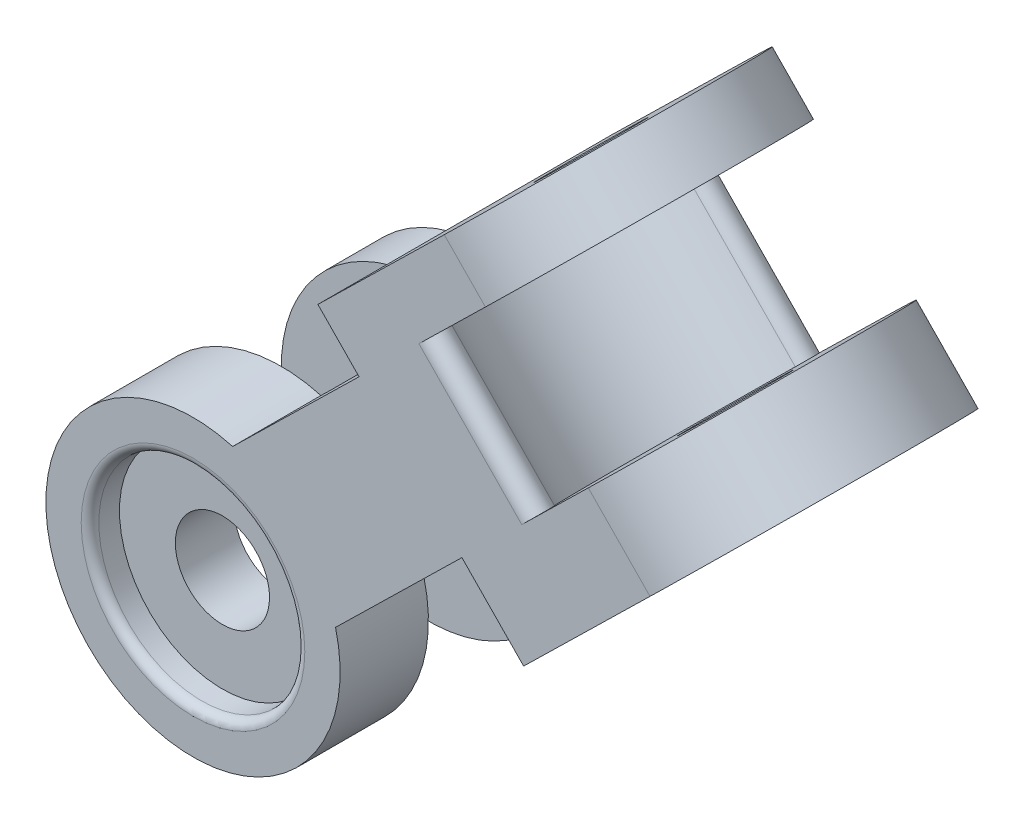
ISO-10303-21;
HEADER;
FILE_DESCRIPTION(('STEP AP214'),'2;1');
FILE_NAME('part.step','',(''),(''),'','','');
FILE_SCHEMA(('AUTOMOTIVE_DESIGN { 1 0 10303 214 1 1 1 1 }'));
ENDSEC;
DATA;
#1=APPLICATION_CONTEXT('core data for automotive mechanical design processes');
#2=APPLICATION_PROTOCOL_DEFINITION('international standard','automotive_design',2000,#1);
#3=PRODUCT_CONTEXT('',#1,'mechanical');
#4=PRODUCT('Part','Part','',(#3));
#5=PRODUCT_RELATED_PRODUCT_CATEGORY('part','',(#4));
#6=PRODUCT_DEFINITION_FORMATION('','',#4);
#7=PRODUCT_DEFINITION_CONTEXT('part definition',#1,'design');
#8=PRODUCT_DEFINITION('design','',#6,#7);
#9=PRODUCT_DEFINITION_SHAPE('','',#8);
#10=(LENGTH_UNIT() NAMED_UNIT(*) SI_UNIT(.MILLI.,.METRE.));
#11=(NAMED_UNIT(*) PLANE_ANGLE_UNIT() SI_UNIT($,.RADIAN.));
#12=(NAMED_UNIT(*) SI_UNIT($,.STERADIAN.) SOLID_ANGLE_UNIT());
#13=UNCERTAINTY_MEASURE_WITH_UNIT(LENGTH_MEASURE(1.E-05),#10,'distance_accuracy_value','');
#14=(GEOMETRIC_REPRESENTATION_CONTEXT(3) GLOBAL_UNCERTAINTY_ASSIGNED_CONTEXT((#13)) GLOBAL_UNIT_ASSIGNED_CONTEXT((#10,
#11,#12)) REPRESENTATION_CONTEXT('',''));
#15=CARTESIAN_POINT('',(0.,0.,0.));
#16=DIRECTION('',(0.,0.,1.));
#17=DIRECTION('',(1.,0.,0.));
#18=AXIS2_PLACEMENT_3D('',#15,#16,#17);
#19=CARTESIAN_POINT('',(-0.251682910888285,0.0196399048580098,2.));
#20=DIRECTION('',(0.,0.,-1.));
#21=DIRECTION('',(-1.,0.,0.));
#22=AXIS2_PLACEMENT_3D('',#19,#20,#21);
#23=CYLINDRICAL_SURFACE('',#22,1.6);
#24=CARTESIAN_POINT('',(-0.251682910888285,0.0196399048580098,-1.));
#25=DIRECTION('',(0.,0.,-1.));
#26=DIRECTION('',(-1.,0.,0.));
#27=AXIS2_PLACEMENT_3D('',#24,#25,#26);
#28=CIRCLE('',#27,1.6);
#29=CARTESIAN_POINT('',(-1.85168291088829,0.0196399048580098,-1.));
#30=VERTEX_POINT('',#29);
#31=EDGE_CURVE('E478',#30,#30,#28,.T.);
#32=ORIENTED_EDGE('',*,*,#31,.T.);
#33=EDGE_LOOP('',(#32));
#34=FACE_BOUND('',#33,.T.);
#35=CARTESIAN_POINT('',(-0.251682910888285,0.0196399048580098,1.));
#36=DIRECTION('',(0.,0.,1.));
#37=DIRECTION('',(1.,0.,0.));
#38=AXIS2_PLACEMENT_3D('',#35,#36,#37);
#39=CIRCLE('',#38,1.6);
#40=CARTESIAN_POINT('',(1.34831708911172,0.0196399048580098,1.));
#41=VERTEX_POINT('',#40);
#42=EDGE_CURVE('E883',#41,#41,#39,.T.);
#43=ORIENTED_EDGE('',*,*,#42,.T.);
#44=EDGE_LOOP('',(#43));
#45=FACE_BOUND('',#44,.T.);
#46=ADVANCED_FACE('F100',(#34,#45),#23,.F.);
#47=CARTESIAN_POINT('',(8.28738801972482,14.6639336938812,-3.));
#48=DIRECTION('',(0.699159308456011,-0.714965916250077,0.));
#49=DIRECTION('',(0.714965916250077,0.699159308456011,0.));
#50=AXIS2_PLACEMENT_3D('',#47,#48,#49);
#51=CYLINDRICAL_SURFACE('',#50,1.6);
#52=CARTESIAN_POINT('',(13.1815031789169,9.65917228013068,-3.));
#53=DIRECTION('',(-0.699159308456011,0.714965916250077,0.));
#54=DIRECTION('',(-0.714965916250077,-0.699159308456011,0.));
#55=AXIS2_PLACEMENT_3D('',#52,#53,#54);
#56=CIRCLE('',#55,1.6);
#57=CARTESIAN_POINT('',(12.0375577129168,8.54051738660106,-3.));
#58=VERTEX_POINT('',#57);
#59=EDGE_CURVE('E454',#58,#58,#56,.T.);
#60=ORIENTED_EDGE('',*,*,#59,.T.);
#61=EDGE_LOOP('',(#60));
#62=FACE_BOUND('',#61,.T.);
#63=CARTESIAN_POINT('',(14.5798217958289,8.22924044763053,-3.));
#64=DIRECTION('',(0.699159308456011,-0.714965916250077,0.));
#65=DIRECTION('',(0.714965916250077,0.699159308456011,0.));
#66=AXIS2_PLACEMENT_3D('',#63,#64,#65);
#67=CIRCLE('',#66,1.6);
#68=CARTESIAN_POINT('',(15.723767261829,9.34789534116014,-3.));
#69=VERTEX_POINT('',#68);
#70=EDGE_CURVE('E875',#69,#69,#67,.T.);
#71=ORIENTED_EDGE('',*,*,#70,.T.);
#72=EDGE_LOOP('',(#71));
#73=FACE_BOUND('',#72,.T.);
#74=ADVANCED_FACE('F343',(#62,#73),#51,.F.);
#75=CARTESIAN_POINT('',(8.28738801972482,14.6639336938812,-3.));
#76=DIRECTION('',(0.699159308456011,-0.714965916250077,0.));
#77=DIRECTION('',(0.714965916250077,0.699159308456011,0.));
#78=AXIS2_PLACEMENT_3D('',#75,#76,#77);
#79=CYLINDRICAL_SURFACE('',#78,5.);
#80=CARTESIAN_POINT('',(9.68570663663685,13.2340018613811,-3.));
#81=DIRECTION('',(0.699159308456011,-0.714965916250077,0.));
#82=DIRECTION('',(0.714965916250077,0.699159308456011,0.));
#83=AXIS2_PLACEMENT_3D('',#80,#81,#82);
#84=CIRCLE('',#83,5.);
#85=CARTESIAN_POINT('',(9.68570663663684,13.2340018613811,-8.));
#86=VERTEX_POINT('',#85);
#87=CARTESIAN_POINT('',(9.68570663663684,13.2340018613811,2.));
#88=VERTEX_POINT('',#87);
#89=EDGE_CURVE('E253',#86,#88,#84,.T.);
#90=ORIENTED_EDGE('',*,*,#89,.F.);
#91=DIRECTION('',(-0.699159308456012,0.714965916250077,0.));
#92=VECTOR('',#91,1.);
#93=CARTESIAN_POINT('',(11.5664509881444,11.3107376035151,-8.));
#94=LINE('',#93,#92);
#95=CARTESIAN_POINT('',(8.28738801972482,14.6639336938812,-8.));
#96=VERTEX_POINT('',#95);
#97=EDGE_CURVE('E419',#86,#96,#94,.T.);
#98=ORIENTED_EDGE('',*,*,#97,.T.);
#99=CARTESIAN_POINT('',(8.28738801972482,14.6639336938812,-3.));
#100=DIRECTION('',(-0.699159308456011,0.714965916250077,0.));
#101=DIRECTION('',(-0.714965916250077,-0.699159308456011,0.));
#102=AXIS2_PLACEMENT_3D('',#99,#100,#101);
#103=CIRCLE('',#102,5.);
#104=CARTESIAN_POINT('',(8.28738801972483,14.6639336938812,2.));
#105=VERTEX_POINT('',#104);
#106=EDGE_CURVE('E265',#105,#96,#103,.T.);
#107=ORIENTED_EDGE('',*,*,#106,.F.);
#108=DIRECTION('',(-0.699159308456012,0.714965916250077,0.));
#109=VECTOR('',#108,1.);
#110=CARTESIAN_POINT('',(11.5664509881444,11.3107376035151,2.));
#111=LINE('',#110,#109);
#112=EDGE_CURVE('E244',#88,#105,#111,.T.);
#113=ORIENTED_EDGE('',*,*,#112,.F.);
#114=EDGE_LOOP('',(#90,#98,#107,#113));
#115=FACE_BOUND('',#114,.T.);
#116=ADVANCED_FACE('F263',(#115),#79,.T.);
#117=CARTESIAN_POINT('',(8.28738801972482,14.6639336938812,-3.));
#118=DIRECTION('',(-0.699159308456011,0.714965916250077,0.));
#119=DIRECTION('',(-0.714965916250077,-0.699159308456011,0.));
#120=AXIS2_PLACEMENT_3D('',#117,#118,#119);
#121=CIRCLE('',#120,1.6);
#122=CARTESIAN_POINT('',(7.1434425537247,13.5452788003516,-3.));
#123=VERTEX_POINT('',#122);
#124=EDGE_CURVE('E461',#123,#123,#121,.T.);
#125=ORIENTED_EDGE('',*,*,#124,.T.);
#126=EDGE_LOOP('',(#125));
#127=FACE_BOUND('',#126,.T.);
#128=CARTESIAN_POINT('',(9.68570663663684,13.2340018613811,-3.));
#129=DIRECTION('',(-0.699159308456011,0.714965916250077,0.));
#130=DIRECTION('',(-0.714965916250077,-0.699159308456011,0.));
#131=AXIS2_PLACEMENT_3D('',#128,#129,#130);
#132=CIRCLE('',#131,1.6);
#133=CARTESIAN_POINT('',(8.54176117063672,12.1153469678514,-3.));
#134=VERTEX_POINT('',#133);
#135=EDGE_CURVE('E460',#134,#134,#132,.T.);
#136=ORIENTED_EDGE('',*,*,#135,.F.);
#137=EDGE_LOOP('',(#136));
#138=FACE_BOUND('',#137,.T.);
#139=ADVANCED_FACE('F353',(#127,#138),#51,.F.);
#140=CARTESIAN_POINT('',(-0.251682910888285,0.0196399048580098,2.));
#141=DIRECTION('',(0.,0.,-1.));
#142=DIRECTION('',(-1.,0.,0.));
#143=AXIS2_PLACEMENT_3D('',#140,#141,#142);
#144=CYLINDRICAL_SURFACE('',#143,5.);
#145=DIRECTION('',(0.,0.,-1.));
#146=VECTOR('',#145,1.);
#147=CARTESIAN_POINT('',(1.0963120495346,4.83450330755953,2.));
#148=LINE('',#147,#146);
#149=CARTESIAN_POINT('',(1.0963120495346,4.83450330755953,2.));
#150=VERTEX_POINT('',#149);
#151=CARTESIAN_POINT('',(1.0963120495346,4.83450330755953,-1.));
#152=VERTEX_POINT('',#151);
#153=EDGE_CURVE('E279',#150,#152,#148,.T.);
#154=ORIENTED_EDGE('',*,*,#153,.T.);
#155=CARTESIAN_POINT('',(-0.251682910888285,0.0196399048580098,-1.));
#156=DIRECTION('',(0.,0.,-1.));
#157=DIRECTION('',(-1.,0.,0.));
#158=AXIS2_PLACEMENT_3D('',#155,#156,#157);
#159=CIRCLE('',#158,5.);
#160=CARTESIAN_POINT('',(4.59210859181466,1.25967372630915,-1.));
#161=VERTEX_POINT('',#160);
#162=EDGE_CURVE('E386',#161,#152,#159,.T.);
#163=ORIENTED_EDGE('',*,*,#162,.F.);
#164=DIRECTION('',(0.,0.,-1.));
#165=VECTOR('',#164,1.);
#166=CARTESIAN_POINT('',(4.59210859181466,1.25967372630915,2.));
#167=LINE('',#166,#165);
#168=CARTESIAN_POINT('',(4.59210859181466,1.25967372630915,2.));
#169=VERTEX_POINT('',#168);
#170=EDGE_CURVE('E276',#169,#161,#167,.T.);
#171=ORIENTED_EDGE('',*,*,#170,.F.);
#172=CARTESIAN_POINT('',(-0.251682910888285,0.0196399048580098,2.));
#173=DIRECTION('',(0.,0.,1.));
#174=DIRECTION('',(1.,0.,0.));
#175=AXIS2_PLACEMENT_3D('',#172,#173,#174);
#176=CIRCLE('',#175,5.);
#177=EDGE_CURVE('E272',#169,#150,#176,.F.);
#178=ORIENTED_EDGE('',*,*,#177,.T.);
#179=EDGE_LOOP('',(#154,#163,#171,#178));
#180=FACE_BOUND('',#179,.T.);
#181=ADVANCED_FACE('F396',(#180),#144,.T.);
#182=CARTESIAN_POINT('',(-1.88074435150754,1.92326425786598,2.));
#183=DIRECTION('',(0.699159308456011,-0.714965916250078,0.));
#184=DIRECTION('',(0.714965916250078,0.699159308456011,0.));
#185=AXIS2_PLACEMENT_3D('',#182,#183,#184);
#186=PLANE('',#185);
#187=DIRECTION('',(0.,0.,-1.));
#188=VECTOR('',#187,1.);
#189=CARTESIAN_POINT('',(1.44785961913622,5.17827879400677,2.));
#190=LINE('',#189,#188);
#191=CARTESIAN_POINT('',(1.44785961913622,5.17827879400677,-6.));
#192=VERTEX_POINT('',#191);
#193=CARTESIAN_POINT('',(1.44785961913622,5.17827879400677,-1.));
#194=VERTEX_POINT('',#193);
#195=EDGE_CURVE('E304',#192,#194,#190,.F.);
#196=ORIENTED_EDGE('',*,*,#195,.T.);
#197=DIRECTION('',(-0.714965916250078,-0.699159308456011,0.));
#198=VECTOR('',#197,1.);
#199=CARTESIAN_POINT('',(-1.99958118202832,1.80705469548321,-1.));
#200=LINE('',#199,#198);
#201=EDGE_CURVE('E307',#194,#152,#200,.T.);
#202=ORIENTED_EDGE('',*,*,#201,.T.);
#203=ORIENTED_EDGE('',*,*,#153,.F.);
#204=DIRECTION('',(-0.714965916250078,-0.699159308456011,0.));
#205=VECTOR('',#204,1.);
#206=CARTESIAN_POINT('',(-1.88074435150754,1.92326425786598,2.));
#207=LINE('',#206,#205);
#208=CARTESIAN_POINT('',(5.39100934308572,9.0342525844703,2.));
#209=VERTEX_POINT('',#208);
#210=EDGE_CURVE('E392',#209,#150,#207,.T.);
#211=ORIENTED_EDGE('',*,*,#210,.F.);
#212=DIRECTION('',(0.,0.,1.));
#213=VECTOR('',#212,1.);
#214=CARTESIAN_POINT('',(5.39100934308572,9.0342525844703,0.));
#215=LINE('',#214,#213);
#216=CARTESIAN_POINT('',(5.39100934308572,9.0342525844703,-8.));
#217=VERTEX_POINT('',#216);
#218=EDGE_CURVE('E464',#217,#209,#215,.T.);
#219=ORIENTED_EDGE('',*,*,#218,.F.);
#220=DIRECTION('',(-0.714965916250078,-0.699159308456011,0.));
#221=VECTOR('',#220,1.);
#222=CARTESIAN_POINT('',(-1.88074435150754,1.92326425786598,-8.));
#223=LINE('',#222,#221);
#224=CARTESIAN_POINT('',(1.0963120495346,4.83450330755953,-8.));
#225=VERTEX_POINT('',#224);
#226=EDGE_CURVE('E383',#217,#225,#223,.T.);
#227=ORIENTED_EDGE('',*,*,#226,.T.);
#228=CARTESIAN_POINT('',(1.0963120495346,4.83450330755953,-6.));
#229=VERTEX_POINT('',#228);
#230=EDGE_CURVE('E278',#229,#225,#148,.T.);
#231=ORIENTED_EDGE('',*,*,#230,.F.);
#232=DIRECTION('',(0.714965916250078,0.699159308456011,0.));
#233=VECTOR('',#232,1.);
#234=CARTESIAN_POINT('',(-1.88074435150754,1.92326425786598,-6.));
#235=LINE('',#234,#233);
#236=EDGE_CURVE('E123',#229,#192,#235,.T.);
#237=ORIENTED_EDGE('',*,*,#236,.T.);
#238=EDGE_LOOP('',(#196,#202,#203,#211,#219,#227,#231,#237));
#239=FACE_BOUND('',#238,.T.);
#240=ADVANCED_FACE('F406',(#239),#186,.F.);
#241=CARTESIAN_POINT('',(-0.251682910888285,0.0196399048580098,-6.));
#242=DIRECTION('',(0.,0.,-1.));
#243=DIRECTION('',(-1.,0.,0.));
#244=AXIS2_PLACEMENT_3D('',#241,#242,#243);
#245=CIRCLE('',#244,5.);
#246=CARTESIAN_POINT('',(4.59210859181466,1.25967372630915,-6.));
#247=VERTEX_POINT('',#246);
#248=EDGE_CURVE('E412',#247,#229,#245,.T.);
#249=ORIENTED_EDGE('',*,*,#248,.T.);
#250=ORIENTED_EDGE('',*,*,#230,.T.);
#251=CARTESIAN_POINT('',(-0.251682910888285,0.0196399048580098,-8.));
#252=DIRECTION('',(0.,0.,-1.));
#253=DIRECTION('',(-1.,0.,0.));
#254=AXIS2_PLACEMENT_3D('',#251,#252,#253);
#255=CIRCLE('',#254,5.);
#256=CARTESIAN_POINT('',(4.59210859181466,1.25967372630915,-8.));
#257=VERTEX_POINT('',#256);
#258=EDGE_CURVE('E379',#257,#225,#255,.T.);
#259=ORIENTED_EDGE('',*,*,#258,.F.);
#260=EDGE_CURVE('E270',#247,#257,#167,.T.);
#261=ORIENTED_EDGE('',*,*,#260,.F.);
#262=EDGE_LOOP('',(#249,#250,#259,#261));
#263=FACE_BOUND('',#262,.T.);
#264=ADVANCED_FACE('F369',(#263),#144,.T.);
#265=CARTESIAN_POINT('',(1.61505219077253,-1.65156532338441,2.));
#266=DIRECTION('',(-0.699159308456011,0.714965916250077,0.));
#267=DIRECTION('',(-0.714965916250077,-0.699159308456011,0.));
#268=AXIS2_PLACEMENT_3D('',#265,#266,#267);
#269=PLANE('',#268);
#270=DIRECTION('',(0.,0.,-1.));
#271=VECTOR('',#270,1.);
#272=CARTESIAN_POINT('',(4.94365616141628,1.60344921275638,2.));
#273=LINE('',#272,#271);
#274=CARTESIAN_POINT('',(4.94365616141628,1.60344921275638,-1.));
#275=VERTEX_POINT('',#274);
#276=CARTESIAN_POINT('',(4.94365616141628,1.60344921275638,-6.));
#277=VERTEX_POINT('',#276);
#278=EDGE_CURVE('E314',#275,#277,#273,.T.);
#279=ORIENTED_EDGE('',*,*,#278,.T.);
#280=DIRECTION('',(-0.714965916250077,-0.699159308456011,0.));
#281=VECTOR('',#280,1.);
#282=CARTESIAN_POINT('',(1.61505219077253,-1.65156532338441,-6.));
#283=LINE('',#282,#281);
#284=EDGE_CURVE('E317',#277,#247,#283,.T.);
#285=ORIENTED_EDGE('',*,*,#284,.T.);
#286=ORIENTED_EDGE('',*,*,#260,.T.);
#287=DIRECTION('',(0.714965916250077,0.699159308456011,0.));
#288=VECTOR('',#287,1.);
#289=CARTESIAN_POINT('',(1.61505219077253,-1.65156532338441,-8.));
#290=LINE('',#289,#288);
#291=CARTESIAN_POINT('',(8.88680588536578,5.45942300321991,-8.));
#292=VERTEX_POINT('',#291);
#293=EDGE_CURVE('E417',#257,#292,#290,.T.);
#294=ORIENTED_EDGE('',*,*,#293,.T.);
#295=DIRECTION('',(0.,0.,1.));
#296=VECTOR('',#295,1.);
#297=CARTESIAN_POINT('',(8.88680588536578,5.45942300321991,2.));
#298=LINE('',#297,#296);
#299=CARTESIAN_POINT('',(8.88680588536578,5.45942300321991,2.));
#300=VERTEX_POINT('',#299);
#301=EDGE_CURVE('E458',#292,#300,#298,.T.);
#302=ORIENTED_EDGE('',*,*,#301,.T.);
#303=DIRECTION('',(0.714965916250077,0.699159308456011,0.));
#304=VECTOR('',#303,1.);
#305=CARTESIAN_POINT('',(1.61505219077253,-1.65156532338441,2.));
#306=LINE('',#305,#304);
#307=EDGE_CURVE('E267',#169,#300,#306,.T.);
#308=ORIENTED_EDGE('',*,*,#307,.F.);
#309=ORIENTED_EDGE('',*,*,#170,.T.);
#310=DIRECTION('',(0.714965916250077,0.699159308456011,0.));
#311=VECTOR('',#310,1.);
#312=CARTESIAN_POINT('',(1.49621536025174,-1.76777488576718,-1.));
#313=LINE('',#312,#311);
#314=EDGE_CURVE('E115',#161,#275,#313,.T.);
#315=ORIENTED_EDGE('',*,*,#314,.T.);
#316=EDGE_LOOP('',(#279,#285,#286,#294,#302,#308,#309,#315));
#317=FACE_BOUND('',#316,.T.);
#318=ADVANCED_FACE('F359',(#317),#269,.F.);
#319=CARTESIAN_POINT('',(-0.251682910888285,0.0196399048580098,-6.));
#320=DIRECTION('',(0.,0.,-1.));
#321=DIRECTION('',(-1.,0.,0.));
#322=AXIS2_PLACEMENT_3D('',#319,#320,#321);
#323=CIRCLE('',#322,1.6);
#324=CARTESIAN_POINT('',(-1.85168291088829,0.0196399048580098,-6.));
#325=VERTEX_POINT('',#324);
#326=EDGE_CURVE('E374',#325,#325,#323,.T.);
#327=ORIENTED_EDGE('',*,*,#326,.F.);
#328=EDGE_LOOP('',(#327));
#329=FACE_BOUND('',#328,.T.);
#330=CARTESIAN_POINT('',(-0.251682910888285,0.0196399048580098,-8.));
#331=DIRECTION('',(0.,0.,-1.));
#332=DIRECTION('',(-1.,0.,0.));
#333=AXIS2_PLACEMENT_3D('',#330,#331,#332);
#334=CIRCLE('',#333,1.6);
#335=CARTESIAN_POINT('',(-1.85168291088829,0.0196399048580098,-8.));
#336=VERTEX_POINT('',#335);
#337=EDGE_CURVE('E377',#336,#336,#334,.T.);
#338=ORIENTED_EDGE('',*,*,#337,.T.);
#339=EDGE_LOOP('',(#338));
#340=FACE_BOUND('',#339,.T.);
#341=ADVANCED_FACE('F346',(#329,#340),#23,.F.);
#342=CARTESIAN_POINT('',(0.,0.,2.));
#343=DIRECTION('',(0.,0.,1.));
#344=DIRECTION('',(1.,0.,0.));
#345=AXIS2_PLACEMENT_3D('',#342,#343,#344);
#346=PLANE('',#345);
#347=CARTESIAN_POINT('',(-0.251682910888285,0.0196399048580098,2.));
#348=DIRECTION('',(0.,0.,1.));
#349=DIRECTION('',(1.,0.,0.));
#350=AXIS2_PLACEMENT_3D('',#347,#348,#349);
#351=CIRCLE('',#350,3.8);
#352=CARTESIAN_POINT('',(3.54831708911172,0.0196399048580098,2.));
#353=VERTEX_POINT('',#352);
#354=EDGE_CURVE('E12',#353,#353,#351,.F.);
#355=ORIENTED_EDGE('',*,*,#354,.T.);
#356=EDGE_LOOP('',(#355));
#357=FACE_BOUND('',#356,.T.);
#358=DIRECTION('',(-0.699159308456011,0.714965916250077,0.));
#359=VECTOR('',#358,1.);
#360=CARTESIAN_POINT('',(9.30553024340495,9.09980174148588,2.));
#361=LINE('',#360,#359);
#362=CARTESIAN_POINT('',(10.9205824341775,7.44823641810147,2.));
#363=VERTEX_POINT('',#362);
#364=CARTESIAN_POINT('',(7.42478589189741,11.0230659993519,2.));
#365=VERTEX_POINT('',#364);
#366=EDGE_CURVE('E248',#363,#365,#361,.T.);
#367=ORIENTED_EDGE('',*,*,#366,.T.);
#368=DIRECTION('',(0.714965916250077,0.699159308456011,0.));
#369=VECTOR('',#368,1.);
#370=CARTESIAN_POINT('',(-1.88074435150754,1.92326425786598,2.));
#371=LINE('',#370,#369);
#372=EDGE_CURVE('E239',#365,#88,#371,.T.);
#373=ORIENTED_EDGE('',*,*,#372,.T.);
#374=ORIENTED_EDGE('',*,*,#112,.T.);
#375=DIRECTION('',(0.714965916250077,0.699159308456011,0.));
#376=VECTOR('',#375,1.);
#377=CARTESIAN_POINT('',(-3.27906296841956,3.35319609036614,2.));
#378=LINE('',#377,#376);
#379=CARTESIAN_POINT('',(3.9926907261737,10.4641844169705,2.));
#380=VERTEX_POINT('',#379);
#381=EDGE_CURVE('E472',#380,#105,#378,.T.);
#382=ORIENTED_EDGE('',*,*,#381,.F.);
#383=DIRECTION('',(0.699159308456011,-0.714965916250077,0.));
#384=VECTOR('',#383,1.);
#385=CARTESIAN_POINT('',(3.9926907261737,10.4641844169705,2.));
#386=LINE('',#385,#384);
#387=EDGE_CURVE('E402',#380,#209,#386,.T.);
#388=ORIENTED_EDGE('',*,*,#387,.T.);
#389=ORIENTED_EDGE('',*,*,#210,.T.);
#390=ORIENTED_EDGE('',*,*,#177,.F.);
#391=ORIENTED_EDGE('',*,*,#307,.T.);
#392=DIRECTION('',(-0.699159308456011,0.714965916250077,0.));
#393=VECTOR('',#392,1.);
#394=CARTESIAN_POINT('',(10.9842838107338,3.31452525446968,2.));
#395=LINE('',#394,#393);
#396=CARTESIAN_POINT('',(10.9842838107338,3.31452525446968,2.));
#397=VERTEX_POINT('',#396);
#398=EDGE_CURVE('E452',#397,#300,#395,.T.);
#399=ORIENTED_EDGE('',*,*,#398,.F.);
#400=DIRECTION('',(0.714965916250077,0.699159308456011,0.));
#401=VECTOR('',#400,1.);
#402=CARTESIAN_POINT('',(3.71253011614055,-3.79646307213464,2.));
#403=LINE('',#402,#401);
#404=CARTESIAN_POINT('',(15.2789811042849,7.51427453138045,2.));
#405=VERTEX_POINT('',#404);
#406=EDGE_CURVE('E445',#397,#405,#403,.T.);
#407=ORIENTED_EDGE('',*,*,#406,.T.);
#408=CARTESIAN_POINT('',(13.1815031789169,9.65917228013069,2.));
#409=VERTEX_POINT('',#408);
#410=EDGE_CURVE('E266',#405,#409,#111,.T.);
#411=ORIENTED_EDGE('',*,*,#410,.T.);
#412=DIRECTION('',(-0.714965916250077,-0.699159308456011,0.));
#413=VECTOR('',#412,1.);
#414=CARTESIAN_POINT('',(1.61505219077252,-1.6515653233844,2.));
#415=LINE('',#414,#413);
#416=EDGE_CURVE('E282',#409,#363,#415,.T.);
#417=ORIENTED_EDGE('',*,*,#416,.T.);
#418=EDGE_LOOP('',(#367,#373,#374,#382,#388,#389,#390,#391,#399,#407,#411,#417));
#419=FACE_BOUND('',#418,.T.);
#420=ADVANCED_FACE('F241',(#357,#419),#346,.T.);
#421=CARTESIAN_POINT('',(0.,0.,-8.));
#422=DIRECTION('',(0.,0.,1.));
#423=DIRECTION('',(1.,0.,0.));
#424=AXIS2_PLACEMENT_3D('',#421,#422,#423);
#425=PLANE('',#424);
#426=ORIENTED_EDGE('',*,*,#97,.F.);
#427=DIRECTION('',(-0.714965916250077,-0.699159308456011,0.));
#428=VECTOR('',#427,1.);
#429=CARTESIAN_POINT('',(-1.88074435150754,1.92326425786598,-8.));
#430=LINE('',#429,#428);
#431=CARTESIAN_POINT('',(7.42478589189741,11.0230659993519,-8.));
#432=VERTEX_POINT('',#431);
#433=EDGE_CURVE('E256',#86,#432,#430,.T.);
#434=ORIENTED_EDGE('',*,*,#433,.T.);
#435=DIRECTION('',(0.699159308456011,-0.714965916250077,0.));
#436=VECTOR('',#435,1.);
#437=CARTESIAN_POINT('',(10.9205824341775,7.44823641810147,-8.));
#438=LINE('',#437,#436);
#439=CARTESIAN_POINT('',(10.9205824341775,7.44823641810147,-8.));
#440=VERTEX_POINT('',#439);
#441=EDGE_CURVE('E291',#432,#440,#438,.T.);
#442=ORIENTED_EDGE('',*,*,#441,.T.);
#443=DIRECTION('',(0.714965916250077,0.699159308456011,0.));
#444=VECTOR('',#443,1.);
#445=CARTESIAN_POINT('',(1.61505219077252,-1.6515653233844,-8.));
#446=LINE('',#445,#444);
#447=CARTESIAN_POINT('',(13.1815031789169,9.65917228013069,-8.));
#448=VERTEX_POINT('',#447);
#449=EDGE_CURVE('E289',#440,#448,#446,.T.);
#450=ORIENTED_EDGE('',*,*,#449,.T.);
#451=CARTESIAN_POINT('',(15.2789811042849,7.51427453138045,-8.));
#452=VERTEX_POINT('',#451);
#453=EDGE_CURVE('E389',#452,#448,#94,.T.);
#454=ORIENTED_EDGE('',*,*,#453,.F.);
#455=DIRECTION('',(-0.714965916250077,-0.699159308456011,0.));
#456=VECTOR('',#455,1.);
#457=CARTESIAN_POINT('',(3.71253011614055,-3.79646307213464,-8.));
#458=LINE('',#457,#456);
#459=CARTESIAN_POINT('',(10.9842838107338,3.31452525446968,-8.));
#460=VERTEX_POINT('',#459);
#461=EDGE_CURVE('E436',#452,#460,#458,.T.);
#462=ORIENTED_EDGE('',*,*,#461,.T.);
#463=DIRECTION('',(-0.699159308456011,0.714965916250077,0.));
#464=VECTOR('',#463,1.);
#465=CARTESIAN_POINT('',(10.9842838107338,3.31452525446968,-8.));
#466=LINE('',#465,#464);
#467=EDGE_CURVE('E451',#460,#292,#466,.T.);
#468=ORIENTED_EDGE('',*,*,#467,.T.);
#469=ORIENTED_EDGE('',*,*,#293,.F.);
#470=ORIENTED_EDGE('',*,*,#258,.T.);
#471=ORIENTED_EDGE('',*,*,#226,.F.);
#472=DIRECTION('',(0.699159308456011,-0.714965916250077,0.));
#473=VECTOR('',#472,1.);
#474=CARTESIAN_POINT('',(3.9926907261737,10.4641844169705,-8.));
#475=LINE('',#474,#473);
#476=CARTESIAN_POINT('',(3.9926907261737,10.4641844169705,-8.));
#477=VERTEX_POINT('',#476);
#478=EDGE_CURVE('E476',#477,#217,#475,.T.);
#479=ORIENTED_EDGE('',*,*,#478,.F.);
#480=DIRECTION('',(-0.714965916250077,-0.699159308456011,0.));
#481=VECTOR('',#480,1.);
#482=CARTESIAN_POINT('',(-3.27906296841956,3.35319609036614,-8.));
#483=LINE('',#482,#481);
#484=EDGE_CURVE('E468',#96,#477,#483,.T.);
#485=ORIENTED_EDGE('',*,*,#484,.F.);
#486=EDGE_LOOP('',(#426,#434,#442,#450,#454,#462,#468,#469,#470,#471,#479,#485));
#487=FACE_BOUND('',#486,.T.);
#488=ORIENTED_EDGE('',*,*,#337,.F.);
#489=EDGE_LOOP('',(#488));
#490=FACE_BOUND('',#489,.T.);
#491=ADVANCED_FACE('F366',(#487,#490),#425,.F.);
#492=CARTESIAN_POINT('',(-0.251682910888285,0.0196399048580098,-1.));
#493=DIRECTION('',(0.,0.,-1.));
#494=DIRECTION('',(-1.,0.,0.));
#495=AXIS2_PLACEMENT_3D('',#492,#493,#494);
#496=CYLINDRICAL_SURFACE('',#495,5.);
#497=CARTESIAN_POINT('',(1.54953437454691,4.68393152209738,-1.));
#498=VERTEX_POINT('',#497);
#499=CARTESIAN_POINT('',(4.45170508889262,1.71614847351215,-1.));
#500=VERTEX_POINT('',#499);
#501=EDGE_CURVE('E380',#498,#500,#159,.T.);
#502=ORIENTED_EDGE('',*,*,#501,.F.);
#503=DIRECTION('',(0.,0.,-1.));
#504=VECTOR('',#503,1.);
#505=CARTESIAN_POINT('',(1.54953437454691,4.68393152209738,-1.));
#506=LINE('',#505,#504);
#507=CARTESIAN_POINT('',(1.54953437454691,4.68393152209738,-6.));
#508=VERTEX_POINT('',#507);
#509=EDGE_CURVE('E311',#498,#508,#506,.T.);
#510=ORIENTED_EDGE('',*,*,#509,.T.);
#511=CARTESIAN_POINT('',(4.45170508889262,1.71614847351215,-6.));
#512=VERTEX_POINT('',#511);
#513=EDGE_CURVE('E410',#508,#512,#245,.T.);
#514=ORIENTED_EDGE('',*,*,#513,.T.);
#515=DIRECTION('',(0.,0.,-1.));
#516=VECTOR('',#515,1.);
#517=CARTESIAN_POINT('',(4.45170508889263,1.71614847351215,-1.));
#518=LINE('',#517,#516);
#519=EDGE_CURVE('E309',#512,#500,#518,.F.);
#520=ORIENTED_EDGE('',*,*,#519,.T.);
#521=EDGE_LOOP('',(#502,#510,#514,#520));
#522=FACE_BOUND('',#521,.T.);
#523=ADVANCED_FACE('F496',(#522),#496,.F.);
#524=CARTESIAN_POINT('',(-0.251682910888285,0.0196399048580098,-1.));
#525=DIRECTION('',(0.,0.,-1.));
#526=DIRECTION('',(-1.,0.,0.));
#527=AXIS2_PLACEMENT_3D('',#524,#525,#526);
#528=PLANE('',#527);
#529=ORIENTED_EDGE('',*,*,#31,.F.);
#530=EDGE_LOOP('',(#529));
#531=FACE_BOUND('',#530,.T.);
#532=ORIENTED_EDGE('',*,*,#162,.T.);
#533=ORIENTED_EDGE('',*,*,#201,.F.);
#534=CARTESIAN_POINT('',(1.65760741167302,4.96378901913174,-1.));
#535=DIRECTION('',(0.,0.,-1.));
#536=DIRECTION('',(-1.,0.,0.));
#537=AXIS2_PLACEMENT_3D('',#534,#535,#536);
#538=CIRCLE('',#537,0.3);
#539=EDGE_CURVE('E319',#194,#498,#538,.F.);
#540=ORIENTED_EDGE('',*,*,#539,.T.);
#541=ORIENTED_EDGE('',*,*,#501,.T.);
#542=CARTESIAN_POINT('',(4.73390836887948,1.8179389876314,-1.));
#543=DIRECTION('',(0.,0.,-1.));
#544=DIRECTION('',(-1.,0.,0.));
#545=AXIS2_PLACEMENT_3D('',#542,#543,#544);
#546=CIRCLE('',#545,0.3);
#547=EDGE_CURVE('E325',#500,#275,#546,.F.);
#548=ORIENTED_EDGE('',*,*,#547,.T.);
#549=ORIENTED_EDGE('',*,*,#314,.F.);
#550=EDGE_LOOP('',(#532,#533,#540,#541,#548,#549));
#551=FACE_BOUND('',#550,.T.);
#552=ADVANCED_FACE('F409',(#531,#551),#528,.T.);
#553=CARTESIAN_POINT('',(-0.251682910888285,0.0196399048580098,-6.));
#554=DIRECTION('',(0.,0.,-1.));
#555=DIRECTION('',(-1.,0.,0.));
#556=AXIS2_PLACEMENT_3D('',#553,#554,#555);
#557=PLANE('',#556);
#558=ORIENTED_EDGE('',*,*,#326,.T.);
#559=EDGE_LOOP('',(#558));
#560=FACE_BOUND('',#559,.T.);
#561=ORIENTED_EDGE('',*,*,#513,.F.);
#562=CARTESIAN_POINT('',(1.65760741167302,4.96378901913174,-6.));
#563=DIRECTION('',(0.,0.,-1.));
#564=DIRECTION('',(-1.,0.,0.));
#565=AXIS2_PLACEMENT_3D('',#562,#563,#564);
#566=CIRCLE('',#565,0.3);
#567=EDGE_CURVE('E321',#508,#192,#566,.T.);
#568=ORIENTED_EDGE('',*,*,#567,.T.);
#569=ORIENTED_EDGE('',*,*,#236,.F.);
#570=ORIENTED_EDGE('',*,*,#248,.F.);
#571=ORIENTED_EDGE('',*,*,#284,.F.);
#572=CARTESIAN_POINT('',(4.73390836887948,1.8179389876314,-6.));
#573=DIRECTION('',(0.,0.,-1.));
#574=DIRECTION('',(-1.,0.,0.));
#575=AXIS2_PLACEMENT_3D('',#572,#573,#574);
#576=CIRCLE('',#575,0.3);
#577=EDGE_CURVE('E323',#277,#512,#576,.T.);
#578=ORIENTED_EDGE('',*,*,#577,.T.);
#579=EDGE_LOOP('',(#561,#568,#569,#570,#571,#578));
#580=FACE_BOUND('',#579,.T.);
#581=ADVANCED_FACE('F482',(#560,#580),#557,.F.);
#582=CARTESIAN_POINT('',(-3.27906296841956,3.35319609036614,0.));
#583=DIRECTION('',(-0.699159308456011,0.714965916250077,0.));
#584=DIRECTION('',(-0.714965916250077,-0.699159308456011,0.));
#585=AXIS2_PLACEMENT_3D('',#582,#583,#584);
#586=PLANE('',#585);
#587=ORIENTED_EDGE('',*,*,#106,.T.);
#588=ORIENTED_EDGE('',*,*,#484,.T.);
#589=DIRECTION('',(0.,0.,1.));
#590=VECTOR('',#589,1.);
#591=CARTESIAN_POINT('',(3.9926907261737,10.4641844169705,0.));
#592=LINE('',#591,#590);
#593=EDGE_CURVE('E470',#477,#380,#592,.T.);
#594=ORIENTED_EDGE('',*,*,#593,.T.);
#595=ORIENTED_EDGE('',*,*,#381,.T.);
#596=EDGE_LOOP('',(#587,#588,#594,#595));
#597=FACE_BOUND('',#596,.T.);
#598=ORIENTED_EDGE('',*,*,#124,.F.);
#599=EDGE_LOOP('',(#598));
#600=FACE_BOUND('',#599,.T.);
#601=ADVANCED_FACE('F484',(#597,#600),#586,.T.);
#602=ORIENTED_EDGE('',*,*,#453,.T.);
#603=CARTESIAN_POINT('',(13.1815031789169,9.65917228013069,-3.));
#604=DIRECTION('',(0.699159308456011,-0.714965916250077,0.));
#605=DIRECTION('',(0.714965916250077,0.699159308456011,0.));
#606=AXIS2_PLACEMENT_3D('',#603,#604,#605);
#607=CIRCLE('',#606,5.);
#608=EDGE_CURVE('E429',#448,#409,#607,.T.);
#609=ORIENTED_EDGE('',*,*,#608,.T.);
#610=ORIENTED_EDGE('',*,*,#410,.F.);
#611=CARTESIAN_POINT('',(15.2789811042849,7.51427453138045,-3.));
#612=DIRECTION('',(-0.699159308456011,0.714965916250077,0.));
#613=DIRECTION('',(-0.714965916250077,-0.699159308456011,0.));
#614=AXIS2_PLACEMENT_3D('',#611,#612,#613);
#615=CIRCLE('',#614,5.);
#616=EDGE_CURVE('E431',#405,#452,#615,.T.);
#617=ORIENTED_EDGE('',*,*,#616,.T.);
#618=EDGE_LOOP('',(#602,#609,#610,#617));
#619=FACE_BOUND('',#618,.T.);
#620=ADVANCED_FACE('F427',(#619),#79,.T.);
#621=CARTESIAN_POINT('',(3.9926907261737,10.4641844169705,0.));
#622=DIRECTION('',(0.714965916250077,0.699159308456011,0.));
#623=DIRECTION('',(-0.699159308456011,0.714965916250077,0.));
#624=AXIS2_PLACEMENT_3D('',#621,#622,#623);
#625=PLANE('',#624);
#626=ORIENTED_EDGE('',*,*,#218,.T.);
#627=ORIENTED_EDGE('',*,*,#387,.F.);
#628=ORIENTED_EDGE('',*,*,#593,.F.);
#629=ORIENTED_EDGE('',*,*,#478,.T.);
#630=EDGE_LOOP('',(#626,#627,#628,#629));
#631=FACE_BOUND('',#630,.T.);
#632=ADVANCED_FACE('F509',(#631),#625,.F.);
#633=CARTESIAN_POINT('',(10.9842838107338,3.31452525446968,0.));
#634=DIRECTION('',(-0.714965916250077,-0.699159308456011,0.));
#635=DIRECTION('',(0.699159308456011,-0.714965916250077,0.));
#636=AXIS2_PLACEMENT_3D('',#633,#634,#635);
#637=PLANE('',#636);
#638=ORIENTED_EDGE('',*,*,#301,.F.);
#639=ORIENTED_EDGE('',*,*,#467,.F.);
#640=DIRECTION('',(0.,0.,1.));
#641=VECTOR('',#640,1.);
#642=CARTESIAN_POINT('',(10.9842838107338,3.31452525446968,0.));
#643=LINE('',#642,#641);
#644=EDGE_CURVE('E443',#460,#397,#643,.T.);
#645=ORIENTED_EDGE('',*,*,#644,.T.);
#646=ORIENTED_EDGE('',*,*,#398,.T.);
#647=EDGE_LOOP('',(#638,#639,#645,#646));
#648=FACE_BOUND('',#647,.T.);
#649=ADVANCED_FACE('F501',(#648),#637,.T.);
#650=CARTESIAN_POINT('',(3.71253011614055,-3.79646307213464,0.));
#651=DIRECTION('',(-0.699159308456011,0.714965916250077,0.));
#652=DIRECTION('',(-0.714965916250077,-0.699159308456011,0.));
#653=AXIS2_PLACEMENT_3D('',#650,#651,#652);
#654=PLANE('',#653);
#655=CARTESIAN_POINT('',(15.2789811042849,7.51427453138045,-3.));
#656=DIRECTION('',(0.699159308456011,-0.714965916250077,0.));
#657=DIRECTION('',(0.714965916250077,0.699159308456011,0.));
#658=AXIS2_PLACEMENT_3D('',#655,#656,#657);
#659=CIRCLE('',#658,3.5);
#660=CARTESIAN_POINT('',(17.7813618111602,9.96133211097649,-3.));
#661=VERTEX_POINT('',#660);
#662=EDGE_CURVE('E872',#661,#661,#659,.T.);
#663=ORIENTED_EDGE('',*,*,#662,.F.);
#664=EDGE_LOOP('',(#663));
#665=FACE_BOUND('',#664,.T.);
#666=ORIENTED_EDGE('',*,*,#616,.F.);
#667=ORIENTED_EDGE('',*,*,#406,.F.);
#668=ORIENTED_EDGE('',*,*,#644,.F.);
#669=ORIENTED_EDGE('',*,*,#461,.F.);
#670=EDGE_LOOP('',(#666,#667,#668,#669));
#671=FACE_BOUND('',#670,.T.);
#672=ADVANCED_FACE('F439',(#665,#671),#654,.F.);
#673=CARTESIAN_POINT('',(13.1815031789169,9.65917228013069,-3.));
#674=DIRECTION('',(-0.699159308456011,0.714965916250077,0.));
#675=DIRECTION('',(-0.714965916250077,-0.699159308456011,0.));
#676=AXIS2_PLACEMENT_3D('',#673,#674,#675);
#677=CYLINDRICAL_SURFACE('',#676,5.);
#678=CARTESIAN_POINT('',(7.63032414141918,11.2240601686272,1.09090909090909));
#679=VERTEX_POINT('',#678);
#680=CARTESIAN_POINT('',(7.63032414141918,11.2240601686272,-7.09090909090909));
#681=VERTEX_POINT('',#680);
#682=EDGE_CURVE('E259',#679,#681,#84,.T.);
#683=ORIENTED_EDGE('',*,*,#682,.F.);
#684=DIRECTION('',(-0.699159308456011,0.714965916250077,0.));
#685=VECTOR('',#684,1.);
#686=CARTESIAN_POINT('',(11.1261206836992,7.64923058737686,1.09090909090909));
#687=LINE('',#686,#685);
#688=CARTESIAN_POINT('',(11.1261206836992,7.64923058737686,1.09090909090909));
#689=VERTEX_POINT('',#688);
#690=EDGE_CURVE('E287',#679,#689,#687,.F.);
#691=ORIENTED_EDGE('',*,*,#690,.T.);
#692=CARTESIAN_POINT('',(11.1261206836992,7.64923058737686,-7.09090909090909));
#693=VERTEX_POINT('',#692);
#694=EDGE_CURVE('E447',#689,#693,#607,.T.);
#695=ORIENTED_EDGE('',*,*,#694,.T.);
#696=DIRECTION('',(-0.699159308456011,0.714965916250077,0.));
#697=VECTOR('',#696,1.);
#698=CARTESIAN_POINT('',(11.1261206836992,7.64923058737686,-7.09090909090909));
#699=LINE('',#698,#697);
#700=EDGE_CURVE('E250',#693,#681,#699,.T.);
#701=ORIENTED_EDGE('',*,*,#700,.T.);
#702=EDGE_LOOP('',(#683,#691,#695,#701));
#703=FACE_BOUND('',#702,.T.);
#704=ADVANCED_FACE('F531',(#703),#677,.F.);
#705=CARTESIAN_POINT('',(1.61505219077252,-1.6515653233844,0.));
#706=DIRECTION('',(0.699159308456011,-0.714965916250077,0.));
#707=DIRECTION('',(0.714965916250077,0.699159308456011,0.));
#708=AXIS2_PLACEMENT_3D('',#705,#706,#707);
#709=PLANE('',#708);
#710=ORIENTED_EDGE('',*,*,#59,.F.);
#711=EDGE_LOOP('',(#710));
#712=FACE_BOUND('',#711,.T.);
#713=ORIENTED_EDGE('',*,*,#694,.F.);
#714=CARTESIAN_POINT('',(10.9205824341775,7.44823641810147,1.5));
#715=DIRECTION('',(0.699159308456011,-0.714965916250077,0.));
#716=DIRECTION('',(0.714965916250077,0.699159308456011,0.));
#717=AXIS2_PLACEMENT_3D('',#714,#715,#716);
#718=CIRCLE('',#717,0.5);
#719=EDGE_CURVE('E297',#689,#363,#718,.T.);
#720=ORIENTED_EDGE('',*,*,#719,.T.);
#721=ORIENTED_EDGE('',*,*,#416,.F.);
#722=ORIENTED_EDGE('',*,*,#608,.F.);
#723=ORIENTED_EDGE('',*,*,#449,.F.);
#724=CARTESIAN_POINT('',(10.9205824341775,7.44823641810147,-7.5));
#725=DIRECTION('',(0.699159308456011,-0.714965916250077,0.));
#726=DIRECTION('',(0.714965916250077,0.699159308456011,0.));
#727=AXIS2_PLACEMENT_3D('',#724,#725,#726);
#728=CIRCLE('',#727,0.5);
#729=EDGE_CURVE('E301',#440,#693,#728,.T.);
#730=ORIENTED_EDGE('',*,*,#729,.T.);
#731=EDGE_LOOP('',(#713,#720,#721,#722,#723,#730));
#732=FACE_BOUND('',#731,.T.);
#733=ADVANCED_FACE('F521',(#712,#732),#709,.F.);
#734=CARTESIAN_POINT('',(-1.88074435150754,1.92326425786598,0.));
#735=DIRECTION('',(0.699159308456011,-0.714965916250077,0.));
#736=DIRECTION('',(0.714965916250077,0.699159308456011,0.));
#737=AXIS2_PLACEMENT_3D('',#734,#735,#736);
#738=PLANE('',#737);
#739=ORIENTED_EDGE('',*,*,#135,.T.);
#740=EDGE_LOOP('',(#739));
#741=FACE_BOUND('',#740,.T.);
#742=ORIENTED_EDGE('',*,*,#89,.T.);
#743=ORIENTED_EDGE('',*,*,#372,.F.);
#744=CARTESIAN_POINT('',(7.42478589189741,11.0230659993519,1.5));
#745=DIRECTION('',(0.699159308456011,-0.714965916250077,0.));
#746=DIRECTION('',(0.714965916250077,0.699159308456011,0.));
#747=AXIS2_PLACEMENT_3D('',#744,#745,#746);
#748=CIRCLE('',#747,0.5);
#749=EDGE_CURVE('E295',#365,#679,#748,.F.);
#750=ORIENTED_EDGE('',*,*,#749,.T.);
#751=ORIENTED_EDGE('',*,*,#682,.T.);
#752=CARTESIAN_POINT('',(7.42478589189741,11.0230659993519,-7.5));
#753=DIRECTION('',(0.699159308456011,-0.714965916250077,0.));
#754=DIRECTION('',(0.714965916250077,0.699159308456011,0.));
#755=AXIS2_PLACEMENT_3D('',#752,#753,#754);
#756=CIRCLE('',#755,0.5);
#757=EDGE_CURVE('E299',#681,#432,#756,.F.);
#758=ORIENTED_EDGE('',*,*,#757,.T.);
#759=ORIENTED_EDGE('',*,*,#433,.F.);
#760=EDGE_LOOP('',(#742,#743,#750,#751,#758,#759));
#761=FACE_BOUND('',#760,.T.);
#762=ADVANCED_FACE('F254',(#741,#761),#738,.T.);
#763=CARTESIAN_POINT('',(14.5798217958289,8.22924044763053,-3.));
#764=DIRECTION('',(0.699159308456011,-0.714965916250077,0.));
#765=DIRECTION('',(0.714965916250077,0.699159308456011,0.));
#766=AXIS2_PLACEMENT_3D('',#763,#764,#765);
#767=CYLINDRICAL_SURFACE('',#766,3.5);
#768=CARTESIAN_POINT('',(14.5798217958289,8.22924044763053,-3.));
#769=DIRECTION('',(0.699159308456011,-0.714965916250077,0.));
#770=DIRECTION('',(0.714965916250077,0.699159308456011,0.));
#771=AXIS2_PLACEMENT_3D('',#768,#769,#770);
#772=CIRCLE('',#771,3.5);
#773=CARTESIAN_POINT('',(17.0822025027042,10.6762980272266,-3.));
#774=VERTEX_POINT('',#773);
#775=EDGE_CURVE('E260',#774,#774,#772,.T.);
#776=ORIENTED_EDGE('',*,*,#775,.F.);
#777=EDGE_LOOP('',(#776));
#778=FACE_BOUND('',#777,.T.);
#779=ORIENTED_EDGE('',*,*,#662,.T.);
#780=EDGE_LOOP('',(#779));
#781=FACE_BOUND('',#780,.T.);
#782=ADVANCED_FACE('F520',(#778,#781),#767,.F.);
#783=CARTESIAN_POINT('',(14.5798217958289,8.22924044763053,-3.));
#784=DIRECTION('',(0.699159308456011,-0.714965916250077,0.));
#785=DIRECTION('',(0.714965916250077,0.699159308456011,0.));
#786=AXIS2_PLACEMENT_3D('',#783,#784,#785);
#787=PLANE('',#786);
#788=ORIENTED_EDGE('',*,*,#70,.F.);
#789=EDGE_LOOP('',(#788));
#790=FACE_BOUND('',#789,.T.);
#791=ORIENTED_EDGE('',*,*,#775,.T.);
#792=EDGE_LOOP('',(#791));
#793=FACE_BOUND('',#792,.T.);
#794=ADVANCED_FACE('F528',(#790,#793),#787,.T.);
#795=CARTESIAN_POINT('',(10.9205824341775,7.44823641810147,1.5));
#796=DIRECTION('',(-0.699159308456011,0.714965916250077,0.));
#797=DIRECTION('',(-0.714965916250077,-0.699159308456011,0.));
#798=AXIS2_PLACEMENT_3D('',#795,#796,#797);
#799=CYLINDRICAL_SURFACE('',#798,0.5);
#800=ORIENTED_EDGE('',*,*,#719,.F.);
#801=ORIENTED_EDGE('',*,*,#690,.F.);
#802=ORIENTED_EDGE('',*,*,#749,.F.);
#803=ORIENTED_EDGE('',*,*,#366,.F.);
#804=EDGE_LOOP('',(#800,#801,#802,#803));
#805=FACE_BOUND('',#804,.T.);
#806=ADVANCED_FACE('F596',(#805),#799,.T.);
#807=CARTESIAN_POINT('',(10.9205824341775,7.44823641810147,-7.5));
#808=DIRECTION('',(-0.699159308456011,0.714965916250077,0.));
#809=DIRECTION('',(-0.714965916250077,-0.699159308456011,0.));
#810=AXIS2_PLACEMENT_3D('',#807,#808,#809);
#811=CYLINDRICAL_SURFACE('',#810,0.5);
#812=ORIENTED_EDGE('',*,*,#729,.F.);
#813=ORIENTED_EDGE('',*,*,#441,.F.);
#814=ORIENTED_EDGE('',*,*,#757,.F.);
#815=ORIENTED_EDGE('',*,*,#700,.F.);
#816=EDGE_LOOP('',(#812,#813,#814,#815));
#817=FACE_BOUND('',#816,.T.);
#818=ADVANCED_FACE('F604',(#817),#811,.T.);
#819=CARTESIAN_POINT('',(1.65760741167302,4.96378901913174,-1.));
#820=DIRECTION('',(0.,0.,-1.));
#821=DIRECTION('',(-1.,0.,0.));
#822=AXIS2_PLACEMENT_3D('',#819,#820,#821);
#823=CYLINDRICAL_SURFACE('',#822,0.3);
#824=ORIENTED_EDGE('',*,*,#567,.F.);
#825=ORIENTED_EDGE('',*,*,#509,.F.);
#826=ORIENTED_EDGE('',*,*,#539,.F.);
#827=ORIENTED_EDGE('',*,*,#195,.F.);
#828=EDGE_LOOP('',(#824,#825,#826,#827));
#829=FACE_BOUND('',#828,.T.);
#830=ADVANCED_FACE('F493',(#829),#823,.T.);
#831=CARTESIAN_POINT('',(4.73390836887948,1.8179389876314,-1.));
#832=DIRECTION('',(0.,0.,-1.));
#833=DIRECTION('',(-1.,0.,0.));
#834=AXIS2_PLACEMENT_3D('',#831,#832,#833);
#835=CYLINDRICAL_SURFACE('',#834,0.3);
#836=ORIENTED_EDGE('',*,*,#547,.F.);
#837=ORIENTED_EDGE('',*,*,#519,.F.);
#838=ORIENTED_EDGE('',*,*,#577,.F.);
#839=ORIENTED_EDGE('',*,*,#278,.F.);
#840=EDGE_LOOP('',(#836,#837,#838,#839));
#841=FACE_BOUND('',#840,.T.);
#842=ADVANCED_FACE('F498',(#841),#835,.T.);
#843=CARTESIAN_POINT('',(-0.251682910888285,0.0196399048580098,1.));
#844=DIRECTION('',(0.,0.,1.));
#845=DIRECTION('',(1.,0.,0.));
#846=AXIS2_PLACEMENT_3D('',#843,#844,#845);
#847=CYLINDRICAL_SURFACE('',#846,3.5);
#848=CARTESIAN_POINT('',(-0.251682910888285,0.0196399048580098,1.7));
#849=DIRECTION('',(0.,0.,1.));
#850=DIRECTION('',(1.,0.,0.));
#851=AXIS2_PLACEMENT_3D('',#848,#849,#850);
#852=CIRCLE('',#851,3.5);
#853=CARTESIAN_POINT('',(3.24831708911172,0.0196399048580098,1.7));
#854=VERTEX_POINT('',#853);
#855=EDGE_CURVE('E108',#854,#854,#852,.T.);
#856=ORIENTED_EDGE('',*,*,#855,.T.);
#857=EDGE_LOOP('',(#856));
#858=FACE_BOUND('',#857,.T.);
#859=CARTESIAN_POINT('',(-0.251682910888285,0.0196399048580098,1.));
#860=DIRECTION('',(0.,0.,1.));
#861=DIRECTION('',(1.,0.,0.));
#862=AXIS2_PLACEMENT_3D('',#859,#860,#861);
#863=CIRCLE('',#862,3.5);
#864=CARTESIAN_POINT('',(3.24831708911172,0.0196399048580098,1.));
#865=VERTEX_POINT('',#864);
#866=EDGE_CURVE('E880',#865,#865,#863,.T.);
#867=ORIENTED_EDGE('',*,*,#866,.F.);
#868=EDGE_LOOP('',(#867));
#869=FACE_BOUND('',#868,.T.);
#870=ADVANCED_FACE('F329',(#858,#869),#847,.F.);
#871=CARTESIAN_POINT('',(-0.251682910888285,0.0196399048580098,1.));
#872=DIRECTION('',(0.,0.,1.));
#873=DIRECTION('',(1.,0.,0.));
#874=AXIS2_PLACEMENT_3D('',#871,#872,#873);
#875=PLANE('',#874);
#876=ORIENTED_EDGE('',*,*,#42,.F.);
#877=EDGE_LOOP('',(#876));
#878=FACE_BOUND('',#877,.T.);
#879=ORIENTED_EDGE('',*,*,#866,.T.);
#880=EDGE_LOOP('',(#879));
#881=FACE_BOUND('',#880,.T.);
#882=ADVANCED_FACE('F333',(#878,#881),#875,.T.);
#883=CARTESIAN_POINT('',(-0.251682910888285,0.0196399048580098,1.7));
#884=DIRECTION('',(0.,0.,1.));
#885=DIRECTION('',(1.,0.,0.));
#886=AXIS2_PLACEMENT_3D('',#883,#884,#885);
#887=TOROIDAL_SURFACE('',#886,3.8,0.3);
#888=ORIENTED_EDGE('',*,*,#354,.F.);
#889=EDGE_LOOP('',(#888));
#890=FACE_BOUND('',#889,.T.);
#891=ORIENTED_EDGE('',*,*,#855,.F.);
#892=EDGE_LOOP('',(#891));
#893=FACE_BOUND('',#892,.T.);
#894=ADVANCED_FACE('F102',(#890,#893),#887,.T.);
#895=CLOSED_SHELL('',(#46,#74,#116,#139,#181,#240,#264,#318,#341,#420,#491,#523,#552,#581,#601,
#620,#632,#649,#672,#704,#733,#762,#782,#794,#806,#818,#830,#842,#870,#882,#894));
#896=MANIFOLD_SOLID_BREP('B2',#895);
#897=ADVANCED_BREP_SHAPE_REPRESENTATION('',(#18,#896),#14);
#898=SHAPE_DEFINITION_REPRESENTATION(#9,#897);
ENDSEC;
END-ISO-10303-21;
